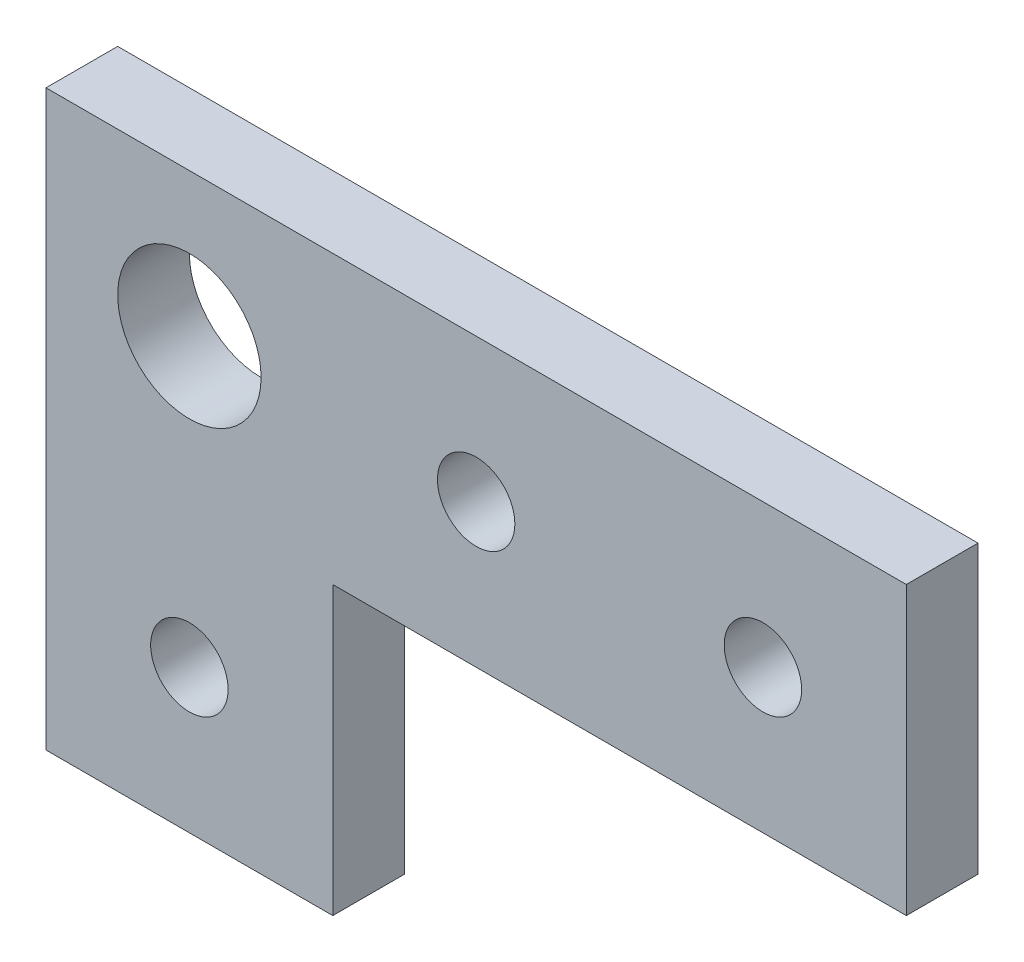
ISO-10303-21;
HEADER;
FILE_DESCRIPTION(('STEP AP214'),'2;1');
FILE_NAME('part.step','',(''),(''),'','','');
FILE_SCHEMA(('AUTOMOTIVE_DESIGN { 1 0 10303 214 1 1 1 1 }'));
ENDSEC;
DATA;
#1=APPLICATION_CONTEXT('core data for automotive mechanical design processes');
#2=APPLICATION_PROTOCOL_DEFINITION('international standard','automotive_design',2000,#1);
#3=PRODUCT_CONTEXT('',#1,'mechanical');
#4=PRODUCT('Part','Part','',(#3));
#5=PRODUCT_RELATED_PRODUCT_CATEGORY('part','',(#4));
#6=PRODUCT_DEFINITION_FORMATION('','',#4);
#7=PRODUCT_DEFINITION_CONTEXT('part definition',#1,'design');
#8=PRODUCT_DEFINITION('design','',#6,#7);
#9=PRODUCT_DEFINITION_SHAPE('','',#8);
#10=(LENGTH_UNIT() NAMED_UNIT(*) SI_UNIT(.MILLI.,.METRE.));
#11=(NAMED_UNIT(*) PLANE_ANGLE_UNIT() SI_UNIT($,.RADIAN.));
#12=(NAMED_UNIT(*) SI_UNIT($,.STERADIAN.) SOLID_ANGLE_UNIT());
#13=UNCERTAINTY_MEASURE_WITH_UNIT(LENGTH_MEASURE(1.E-05),#10,'distance_accuracy_value','');
#14=(GEOMETRIC_REPRESENTATION_CONTEXT(3) GLOBAL_UNCERTAINTY_ASSIGNED_CONTEXT((#13)) GLOBAL_UNIT_ASSIGNED_CONTEXT((#10,
#11,#12)) REPRESENTATION_CONTEXT('',''));
#15=CARTESIAN_POINT('',(0.,0.,0.));
#16=DIRECTION('',(0.,0.,1.));
#17=DIRECTION('',(1.,0.,0.));
#18=AXIS2_PLACEMENT_3D('',#15,#16,#17);
#19=CARTESIAN_POINT('',(25.4,0.,6.35));
#20=DIRECTION('',(0.,1.,0.));
#21=DIRECTION('',(0.,0.,1.));
#22=AXIS2_PLACEMENT_3D('',#19,#20,#21);
#23=PLANE('',#22);
#24=DIRECTION('',(1.,0.,0.));
#25=VECTOR('',#24,1.);
#26=CARTESIAN_POINT('',(25.4,0.,0.));
#27=LINE('',#26,#25);
#28=CARTESIAN_POINT('',(0.,0.,0.));
#29=VERTEX_POINT('',#28);
#30=CARTESIAN_POINT('',(25.4,0.,0.));
#31=VERTEX_POINT('',#30);
#32=EDGE_CURVE('E128',#29,#31,#27,.T.);
#33=ORIENTED_EDGE('',*,*,#32,.T.);
#34=DIRECTION('',(0.,0.,-1.));
#35=VECTOR('',#34,1.);
#36=CARTESIAN_POINT('',(25.4,0.,6.35));
#37=LINE('',#36,#35);
#38=CARTESIAN_POINT('',(25.4,0.,6.35));
#39=VERTEX_POINT('',#38);
#40=EDGE_CURVE('E11',#39,#31,#37,.T.);
#41=ORIENTED_EDGE('',*,*,#40,.F.);
#42=DIRECTION('',(1.,0.,0.));
#43=VECTOR('',#42,1.);
#44=CARTESIAN_POINT('',(25.4,0.,6.35));
#45=LINE('',#44,#43);
#46=CARTESIAN_POINT('',(0.,0.,6.35));
#47=VERTEX_POINT('',#46);
#48=EDGE_CURVE('E145',#47,#39,#45,.T.);
#49=ORIENTED_EDGE('',*,*,#48,.F.);
#50=DIRECTION('',(0.,0.,-1.));
#51=VECTOR('',#50,1.);
#52=CARTESIAN_POINT('',(0.,0.,6.35));
#53=LINE('',#52,#51);
#54=EDGE_CURVE('E124',#47,#29,#53,.T.);
#55=ORIENTED_EDGE('',*,*,#54,.T.);
#56=EDGE_LOOP('',(#33,#41,#49,#55));
#57=FACE_BOUND('',#56,.T.);
#58=ADVANCED_FACE('F39',(#57),#23,.F.);
#59=CARTESIAN_POINT('',(25.4,25.4,6.35));
#60=DIRECTION('',(-1.,0.,0.));
#61=DIRECTION('',(0.,-1.,0.));
#62=AXIS2_PLACEMENT_3D('',#59,#60,#61);
#63=PLANE('',#62);
#64=DIRECTION('',(0.,1.,0.));
#65=VECTOR('',#64,1.);
#66=CARTESIAN_POINT('',(25.4,25.4,0.));
#67=LINE('',#66,#65);
#68=CARTESIAN_POINT('',(25.4,25.4,0.));
#69=VERTEX_POINT('',#68);
#70=EDGE_CURVE('E132',#31,#69,#67,.T.);
#71=ORIENTED_EDGE('',*,*,#70,.T.);
#72=DIRECTION('',(0.,0.,-1.));
#73=VECTOR('',#72,1.);
#74=CARTESIAN_POINT('',(25.4,25.4,6.35));
#75=LINE('',#74,#73);
#76=CARTESIAN_POINT('',(25.4,25.4,6.35));
#77=VERTEX_POINT('',#76);
#78=EDGE_CURVE('E48',#77,#69,#75,.T.);
#79=ORIENTED_EDGE('',*,*,#78,.F.);
#80=DIRECTION('',(0.,1.,0.));
#81=VECTOR('',#80,1.);
#82=CARTESIAN_POINT('',(25.4,25.4,6.35));
#83=LINE('',#82,#81);
#84=EDGE_CURVE('E93',#39,#77,#83,.T.);
#85=ORIENTED_EDGE('',*,*,#84,.F.);
#86=ORIENTED_EDGE('',*,*,#40,.T.);
#87=EDGE_LOOP('',(#71,#79,#85,#86));
#88=FACE_BOUND('',#87,.T.);
#89=ADVANCED_FACE('F174',(#88),#63,.F.);
#90=CARTESIAN_POINT('',(76.2,25.4,6.35));
#91=DIRECTION('',(0.,1.,0.));
#92=DIRECTION('',(-1.,0.,0.));
#93=AXIS2_PLACEMENT_3D('',#90,#91,#92);
#94=PLANE('',#93);
#95=DIRECTION('',(1.,0.,0.));
#96=VECTOR('',#95,1.);
#97=CARTESIAN_POINT('',(76.2,25.4,0.));
#98=LINE('',#97,#96);
#99=CARTESIAN_POINT('',(76.2,25.4,0.));
#100=VERTEX_POINT('',#99);
#101=EDGE_CURVE('E136',#69,#100,#98,.T.);
#102=ORIENTED_EDGE('',*,*,#101,.T.);
#103=DIRECTION('',(0.,0.,-1.));
#104=VECTOR('',#103,1.);
#105=CARTESIAN_POINT('',(76.2,25.4,6.35));
#106=LINE('',#105,#104);
#107=CARTESIAN_POINT('',(76.2,25.4,6.35));
#108=VERTEX_POINT('',#107);
#109=EDGE_CURVE('E117',#108,#100,#106,.T.);
#110=ORIENTED_EDGE('',*,*,#109,.F.);
#111=DIRECTION('',(1.,0.,0.));
#112=VECTOR('',#111,1.);
#113=CARTESIAN_POINT('',(76.2,25.4,6.35));
#114=LINE('',#113,#112);
#115=EDGE_CURVE('E106',#77,#108,#114,.T.);
#116=ORIENTED_EDGE('',*,*,#115,.F.);
#117=ORIENTED_EDGE('',*,*,#78,.T.);
#118=EDGE_LOOP('',(#102,#110,#116,#117));
#119=FACE_BOUND('',#118,.T.);
#120=ADVANCED_FACE('F155',(#119),#94,.F.);
#121=CARTESIAN_POINT('',(76.2,50.8,6.35));
#122=DIRECTION('',(-1.,0.,0.));
#123=DIRECTION('',(0.,-1.,0.));
#124=AXIS2_PLACEMENT_3D('',#121,#122,#123);
#125=PLANE('',#124);
#126=DIRECTION('',(0.,1.,0.));
#127=VECTOR('',#126,1.);
#128=CARTESIAN_POINT('',(76.2,50.8,0.));
#129=LINE('',#128,#127);
#130=CARTESIAN_POINT('',(76.2,50.8,0.));
#131=VERTEX_POINT('',#130);
#132=EDGE_CURVE('E115',#100,#131,#129,.T.);
#133=ORIENTED_EDGE('',*,*,#132,.T.);
#134=DIRECTION('',(0.,0.,-1.));
#135=VECTOR('',#134,1.);
#136=CARTESIAN_POINT('',(76.2,50.8,6.35));
#137=LINE('',#136,#135);
#138=CARTESIAN_POINT('',(76.2,50.8,6.35));
#139=VERTEX_POINT('',#138);
#140=EDGE_CURVE('E112',#139,#131,#137,.T.);
#141=ORIENTED_EDGE('',*,*,#140,.F.);
#142=DIRECTION('',(0.,1.,0.));
#143=VECTOR('',#142,1.);
#144=CARTESIAN_POINT('',(76.2,50.8,6.35));
#145=LINE('',#144,#143);
#146=EDGE_CURVE('E100',#108,#139,#145,.T.);
#147=ORIENTED_EDGE('',*,*,#146,.F.);
#148=ORIENTED_EDGE('',*,*,#109,.T.);
#149=EDGE_LOOP('',(#133,#141,#147,#148));
#150=FACE_BOUND('',#149,.T.);
#151=ADVANCED_FACE('F113',(#150),#125,.F.);
#152=CARTESIAN_POINT('',(0.,50.8,6.35));
#153=DIRECTION('',(0.,-1.,0.));
#154=DIRECTION('',(0.,0.,-1.));
#155=AXIS2_PLACEMENT_3D('',#152,#153,#154);
#156=PLANE('',#155);
#157=DIRECTION('',(-1.,0.,0.));
#158=VECTOR('',#157,1.);
#159=CARTESIAN_POINT('',(0.,50.8,0.));
#160=LINE('',#159,#158);
#161=CARTESIAN_POINT('',(0.,50.8,0.));
#162=VERTEX_POINT('',#161);
#163=EDGE_CURVE('E79',#131,#162,#160,.T.);
#164=ORIENTED_EDGE('',*,*,#163,.T.);
#165=DIRECTION('',(0.,0.,-1.));
#166=VECTOR('',#165,1.);
#167=CARTESIAN_POINT('',(0.,50.8,6.35));
#168=LINE('',#167,#166);
#169=CARTESIAN_POINT('',(0.,50.8,6.35));
#170=VERTEX_POINT('',#169);
#171=EDGE_CURVE('E118',#170,#162,#168,.T.);
#172=ORIENTED_EDGE('',*,*,#171,.F.);
#173=DIRECTION('',(-1.,0.,0.));
#174=VECTOR('',#173,1.);
#175=CARTESIAN_POINT('',(0.,50.8,6.35));
#176=LINE('',#175,#174);
#177=EDGE_CURVE('E104',#139,#170,#176,.T.);
#178=ORIENTED_EDGE('',*,*,#177,.F.);
#179=ORIENTED_EDGE('',*,*,#140,.T.);
#180=EDGE_LOOP('',(#164,#172,#178,#179));
#181=FACE_BOUND('',#180,.T.);
#182=ADVANCED_FACE('F120',(#181),#156,.F.);
#183=CARTESIAN_POINT('',(0.,0.,6.35));
#184=DIRECTION('',(1.,0.,0.));
#185=DIRECTION('',(0.,0.,-1.));
#186=AXIS2_PLACEMENT_3D('',#183,#184,#185);
#187=PLANE('',#186);
#188=DIRECTION('',(0.,-1.,0.));
#189=VECTOR('',#188,1.);
#190=CARTESIAN_POINT('',(0.,0.,0.));
#191=LINE('',#190,#189);
#192=EDGE_CURVE('E85',#162,#29,#191,.T.);
#193=ORIENTED_EDGE('',*,*,#192,.T.);
#194=ORIENTED_EDGE('',*,*,#54,.F.);
#195=DIRECTION('',(0.,-1.,0.));
#196=VECTOR('',#195,1.);
#197=CARTESIAN_POINT('',(0.,0.,6.35));
#198=LINE('',#197,#196);
#199=EDGE_CURVE('E56',#170,#47,#198,.T.);
#200=ORIENTED_EDGE('',*,*,#199,.F.);
#201=ORIENTED_EDGE('',*,*,#171,.T.);
#202=EDGE_LOOP('',(#193,#194,#200,#201));
#203=FACE_BOUND('',#202,.T.);
#204=ADVANCED_FACE('F162',(#203),#187,.F.);
#205=CARTESIAN_POINT('',(0.,0.,6.35));
#206=DIRECTION('',(0.,0.,-1.));
#207=DIRECTION('',(-1.,0.,0.));
#208=AXIS2_PLACEMENT_3D('',#205,#206,#207);
#209=PLANE('',#208);
#210=CARTESIAN_POINT('',(63.5,38.1,6.35));
#211=DIRECTION('',(0.,0.,1.));
#212=DIRECTION('',(1.,0.,0.));
#213=AXIS2_PLACEMENT_3D('',#210,#211,#212);
#214=CIRCLE('',#213,3.429);
#215=CARTESIAN_POINT('',(66.929,38.1,6.35));
#216=VERTEX_POINT('',#215);
#217=EDGE_CURVE('E257',#216,#216,#214,.T.);
#218=ORIENTED_EDGE('',*,*,#217,.F.);
#219=EDGE_LOOP('',(#218));
#220=FACE_BOUND('',#219,.T.);
#221=CARTESIAN_POINT('',(38.1,38.1,6.35));
#222=DIRECTION('',(0.,0.,1.));
#223=DIRECTION('',(1.,0.,0.));
#224=AXIS2_PLACEMENT_3D('',#221,#222,#223);
#225=CIRCLE('',#224,3.429);
#226=CARTESIAN_POINT('',(41.529,38.1,6.35));
#227=VERTEX_POINT('',#226);
#228=EDGE_CURVE('E262',#227,#227,#225,.T.);
#229=ORIENTED_EDGE('',*,*,#228,.F.);
#230=EDGE_LOOP('',(#229));
#231=FACE_BOUND('',#230,.T.);
#232=CARTESIAN_POINT('',(12.7,12.7,6.35));
#233=DIRECTION('',(0.,0.,1.));
#234=DIRECTION('',(1.,0.,0.));
#235=AXIS2_PLACEMENT_3D('',#232,#233,#234);
#236=CIRCLE('',#235,3.429);
#237=CARTESIAN_POINT('',(16.129,12.7,6.35));
#238=VERTEX_POINT('',#237);
#239=EDGE_CURVE('E287',#238,#238,#236,.T.);
#240=ORIENTED_EDGE('',*,*,#239,.F.);
#241=EDGE_LOOP('',(#240));
#242=FACE_BOUND('',#241,.T.);
#243=CARTESIAN_POINT('',(12.7,38.1,6.35));
#244=DIRECTION('',(0.,0.,1.));
#245=DIRECTION('',(1.,0.,0.));
#246=AXIS2_PLACEMENT_3D('',#243,#244,#245);
#247=CIRCLE('',#246,6.35);
#248=CARTESIAN_POINT('',(19.05,38.1,6.35));
#249=VERTEX_POINT('',#248);
#250=EDGE_CURVE('E272',#249,#249,#247,.T.);
#251=ORIENTED_EDGE('',*,*,#250,.F.);
#252=EDGE_LOOP('',(#251));
#253=FACE_BOUND('',#252,.T.);
#254=ORIENTED_EDGE('',*,*,#48,.T.);
#255=ORIENTED_EDGE('',*,*,#84,.T.);
#256=ORIENTED_EDGE('',*,*,#115,.T.);
#257=ORIENTED_EDGE('',*,*,#146,.T.);
#258=ORIENTED_EDGE('',*,*,#177,.T.);
#259=ORIENTED_EDGE('',*,*,#199,.T.);
#260=EDGE_LOOP('',(#254,#255,#256,#257,#258,#259));
#261=FACE_BOUND('',#260,.T.);
#262=ADVANCED_FACE('F102',(#220,#231,#242,#253,#261),#209,.F.);
#263=CARTESIAN_POINT('',(0.,0.,0.));
#264=DIRECTION('',(0.,0.,-1.));
#265=DIRECTION('',(-1.,0.,0.));
#266=AXIS2_PLACEMENT_3D('',#263,#264,#265);
#267=PLANE('',#266);
#268=CARTESIAN_POINT('',(63.5,38.1,0.));
#269=DIRECTION('',(0.,0.,-1.));
#270=DIRECTION('',(-1.,0.,0.));
#271=AXIS2_PLACEMENT_3D('',#268,#269,#270);
#272=CIRCLE('',#271,3.429);
#273=CARTESIAN_POINT('',(60.071,38.1,0.));
#274=VERTEX_POINT('',#273);
#275=EDGE_CURVE('E260',#274,#274,#272,.F.);
#276=ORIENTED_EDGE('',*,*,#275,.T.);
#277=EDGE_LOOP('',(#276));
#278=FACE_BOUND('',#277,.T.);
#279=CARTESIAN_POINT('',(38.1,38.1,0.));
#280=DIRECTION('',(0.,0.,-1.));
#281=DIRECTION('',(-1.,0.,0.));
#282=AXIS2_PLACEMENT_3D('',#279,#280,#281);
#283=CIRCLE('',#282,3.429);
#284=CARTESIAN_POINT('',(34.671,38.1,0.));
#285=VERTEX_POINT('',#284);
#286=EDGE_CURVE('E267',#285,#285,#283,.F.);
#287=ORIENTED_EDGE('',*,*,#286,.T.);
#288=EDGE_LOOP('',(#287));
#289=FACE_BOUND('',#288,.T.);
#290=CARTESIAN_POINT('',(12.7,12.7,0.));
#291=DIRECTION('',(0.,0.,-1.));
#292=DIRECTION('',(-1.,0.,0.));
#293=AXIS2_PLACEMENT_3D('',#290,#291,#292);
#294=CIRCLE('',#293,3.429);
#295=CARTESIAN_POINT('',(9.271,12.7,0.));
#296=VERTEX_POINT('',#295);
#297=EDGE_CURVE('E276',#296,#296,#294,.F.);
#298=ORIENTED_EDGE('',*,*,#297,.T.);
#299=EDGE_LOOP('',(#298));
#300=FACE_BOUND('',#299,.T.);
#301=CARTESIAN_POINT('',(12.7,38.1,0.));
#302=DIRECTION('',(0.,0.,-1.));
#303=DIRECTION('',(-1.,0.,0.));
#304=AXIS2_PLACEMENT_3D('',#301,#302,#303);
#305=CIRCLE('',#304,6.35);
#306=CARTESIAN_POINT('',(6.35,38.1,0.));
#307=VERTEX_POINT('',#306);
#308=EDGE_CURVE('E133',#307,#307,#305,.F.);
#309=ORIENTED_EDGE('',*,*,#308,.T.);
#310=EDGE_LOOP('',(#309));
#311=FACE_BOUND('',#310,.T.);
#312=ORIENTED_EDGE('',*,*,#32,.F.);
#313=ORIENTED_EDGE('',*,*,#192,.F.);
#314=ORIENTED_EDGE('',*,*,#163,.F.);
#315=ORIENTED_EDGE('',*,*,#132,.F.);
#316=ORIENTED_EDGE('',*,*,#101,.F.);
#317=ORIENTED_EDGE('',*,*,#70,.F.);
#318=EDGE_LOOP('',(#312,#313,#314,#315,#316,#317));
#319=FACE_BOUND('',#318,.T.);
#320=ADVANCED_FACE('F158',(#278,#289,#300,#311,#319),#267,.T.);
#321=CARTESIAN_POINT('',(12.7,38.1,-17.9605122421383));
#322=DIRECTION('',(0.,0.,1.));
#323=DIRECTION('',(1.,0.,0.));
#324=AXIS2_PLACEMENT_3D('',#321,#322,#323);
#325=CYLINDRICAL_SURFACE('',#324,6.35);
#326=ORIENTED_EDGE('',*,*,#250,.T.);
#327=EDGE_LOOP('',(#326));
#328=FACE_BOUND('',#327,.T.);
#329=ORIENTED_EDGE('',*,*,#308,.F.);
#330=EDGE_LOOP('',(#329));
#331=FACE_BOUND('',#330,.T.);
#332=ADVANCED_FACE('F211',(#328,#331),#325,.F.);
#333=CARTESIAN_POINT('',(12.7,12.7,-17.9605122421383));
#334=DIRECTION('',(0.,0.,1.));
#335=DIRECTION('',(1.,0.,0.));
#336=AXIS2_PLACEMENT_3D('',#333,#334,#335);
#337=CYLINDRICAL_SURFACE('',#336,3.429);
#338=ORIENTED_EDGE('',*,*,#239,.T.);
#339=EDGE_LOOP('',(#338));
#340=FACE_BOUND('',#339,.T.);
#341=ORIENTED_EDGE('',*,*,#297,.F.);
#342=EDGE_LOOP('',(#341));
#343=FACE_BOUND('',#342,.T.);
#344=ADVANCED_FACE('F220',(#340,#343),#337,.F.);
#345=CARTESIAN_POINT('',(38.1,38.1,-17.9605122421383));
#346=DIRECTION('',(0.,0.,1.));
#347=DIRECTION('',(1.,0.,0.));
#348=AXIS2_PLACEMENT_3D('',#345,#346,#347);
#349=CYLINDRICAL_SURFACE('',#348,3.429);
#350=ORIENTED_EDGE('',*,*,#228,.T.);
#351=EDGE_LOOP('',(#350));
#352=FACE_BOUND('',#351,.T.);
#353=ORIENTED_EDGE('',*,*,#286,.F.);
#354=EDGE_LOOP('',(#353));
#355=FACE_BOUND('',#354,.T.);
#356=ADVANCED_FACE('F230',(#352,#355),#349,.F.);
#357=CARTESIAN_POINT('',(63.5,38.1,-17.9605122421383));
#358=DIRECTION('',(0.,0.,1.));
#359=DIRECTION('',(1.,0.,0.));
#360=AXIS2_PLACEMENT_3D('',#357,#358,#359);
#361=CYLINDRICAL_SURFACE('',#360,3.429);
#362=ORIENTED_EDGE('',*,*,#217,.T.);
#363=EDGE_LOOP('',(#362));
#364=FACE_BOUND('',#363,.T.);
#365=ORIENTED_EDGE('',*,*,#275,.F.);
#366=EDGE_LOOP('',(#365));
#367=FACE_BOUND('',#366,.T.);
#368=ADVANCED_FACE('F240',(#364,#367),#361,.F.);
#369=CLOSED_SHELL('',(#58,#89,#120,#151,#182,#204,#262,#320,#332,#344,#356,#368));
#370=MANIFOLD_SOLID_BREP('B2',#369);
#371=ADVANCED_BREP_SHAPE_REPRESENTATION('',(#18,#370),#14);
#372=SHAPE_DEFINITION_REPRESENTATION(#9,#371);
ENDSEC;
END-ISO-10303-21;
